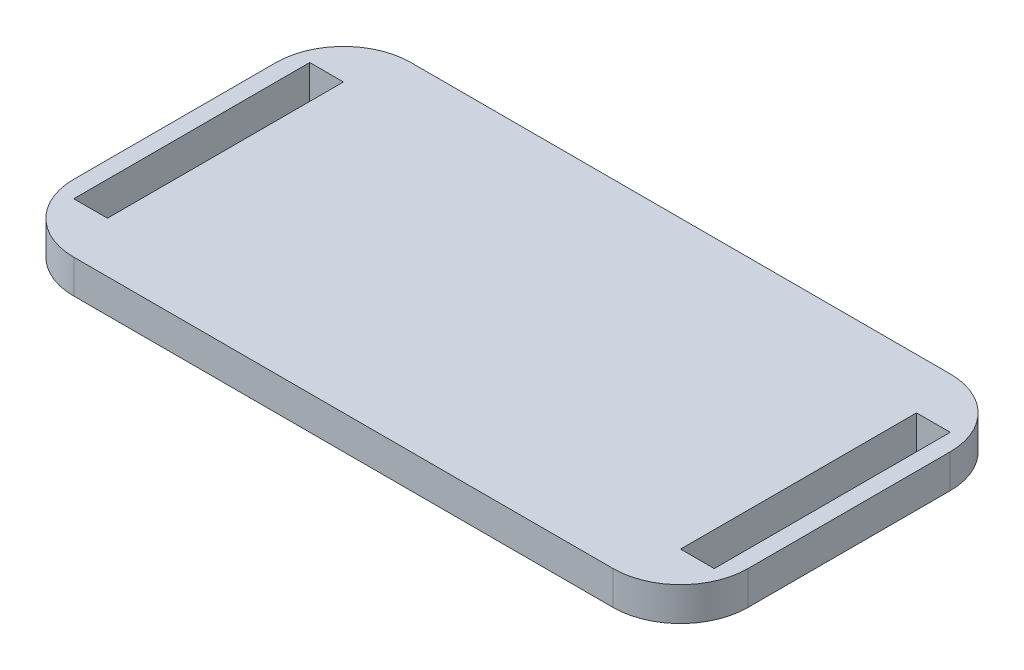
ISO-10303-21;
HEADER;
FILE_DESCRIPTION(('STEP AP214'),'2;1');
FILE_NAME('part.step','',(''),(''),'','','');
FILE_SCHEMA(('AUTOMOTIVE_DESIGN { 1 0 10303 214 1 1 1 1 }'));
ENDSEC;
DATA;
#1=APPLICATION_CONTEXT('core data for automotive mechanical design processes');
#2=APPLICATION_PROTOCOL_DEFINITION('international standard','automotive_design',2000,#1);
#3=PRODUCT_CONTEXT('',#1,'mechanical');
#4=PRODUCT('Part','Part','',(#3));
#5=PRODUCT_RELATED_PRODUCT_CATEGORY('part','',(#4));
#6=PRODUCT_DEFINITION_FORMATION('','',#4);
#7=PRODUCT_DEFINITION_CONTEXT('part definition',#1,'design');
#8=PRODUCT_DEFINITION('design','',#6,#7);
#9=PRODUCT_DEFINITION_SHAPE('','',#8);
#10=(LENGTH_UNIT() NAMED_UNIT(*) SI_UNIT(.MILLI.,.METRE.));
#11=(NAMED_UNIT(*) PLANE_ANGLE_UNIT() SI_UNIT($,.RADIAN.));
#12=(NAMED_UNIT(*) SI_UNIT($,.STERADIAN.) SOLID_ANGLE_UNIT());
#13=UNCERTAINTY_MEASURE_WITH_UNIT(LENGTH_MEASURE(1.E-05),#10,'distance_accuracy_value','');
#14=(GEOMETRIC_REPRESENTATION_CONTEXT(3) GLOBAL_UNCERTAINTY_ASSIGNED_CONTEXT((#13)) GLOBAL_UNIT_ASSIGNED_CONTEXT((#10,
#11,#12)) REPRESENTATION_CONTEXT('',''));
#15=CARTESIAN_POINT('',(0.,0.,0.));
#16=DIRECTION('',(0.,0.,1.));
#17=DIRECTION('',(1.,0.,0.));
#18=AXIS2_PLACEMENT_3D('',#15,#16,#17);
#19=CARTESIAN_POINT('',(40.,5.,-15.));
#20=DIRECTION('',(0.,-1.,0.));
#21=DIRECTION('',(0.,0.,-1.));
#22=AXIS2_PLACEMENT_3D('',#19,#20,#21);
#23=PLANE('',#22);
#24=DIRECTION('',(0.,0.,-1.));
#25=VECTOR('',#24,1.);
#26=CARTESIAN_POINT('',(-42.5,5.,17.5));
#27=LINE('',#26,#25);
#28=CARTESIAN_POINT('',(-42.5,5.,17.5));
#29=VERTEX_POINT('',#28);
#30=CARTESIAN_POINT('',(-42.5,5.,-17.5));
#31=VERTEX_POINT('',#30);
#32=EDGE_CURVE('E182',#29,#31,#27,.T.);
#33=ORIENTED_EDGE('',*,*,#32,.F.);
#34=DIRECTION('',(1.,0.,0.));
#35=VECTOR('',#34,1.);
#36=CARTESIAN_POINT('',(-47.5,5.,17.5));
#37=LINE('',#36,#35);
#38=CARTESIAN_POINT('',(-47.5,5.,17.5));
#39=VERTEX_POINT('',#38);
#40=EDGE_CURVE('E190',#39,#29,#37,.T.);
#41=ORIENTED_EDGE('',*,*,#40,.F.);
#42=DIRECTION('',(0.,0.,1.));
#43=VECTOR('',#42,1.);
#44=CARTESIAN_POINT('',(-47.5,5.,17.5));
#45=LINE('',#44,#43);
#46=CARTESIAN_POINT('',(-47.5,5.,-17.5));
#47=VERTEX_POINT('',#46);
#48=EDGE_CURVE('E187',#47,#39,#45,.T.);
#49=ORIENTED_EDGE('',*,*,#48,.F.);
#50=DIRECTION('',(-1.,0.,0.));
#51=VECTOR('',#50,1.);
#52=CARTESIAN_POINT('',(-47.5,5.,-17.5));
#53=LINE('',#52,#51);
#54=EDGE_CURVE('E184',#31,#47,#53,.T.);
#55=ORIENTED_EDGE('',*,*,#54,.F.);
#56=EDGE_LOOP('',(#33,#41,#49,#55));
#57=FACE_BOUND('',#56,.T.);
#58=CARTESIAN_POINT('',(40.,5.,-15.));
#59=DIRECTION('',(0.,1.,0.));
#60=DIRECTION('',(0.,0.,-1.));
#61=AXIS2_PLACEMENT_3D('',#58,#59,#60);
#62=CIRCLE('',#61,10.);
#63=CARTESIAN_POINT('',(50.,5.,-14.9999999999999));
#64=VERTEX_POINT('',#63);
#65=CARTESIAN_POINT('',(39.9999999999999,5.,-25.));
#66=VERTEX_POINT('',#65);
#67=EDGE_CURVE('E213',#64,#66,#62,.T.);
#68=ORIENTED_EDGE('',*,*,#67,.T.);
#69=DIRECTION('',(-1.,0.,0.));
#70=VECTOR('',#69,1.);
#71=CARTESIAN_POINT('',(-39.9999999999999,5.,-25.));
#72=LINE('',#71,#70);
#73=CARTESIAN_POINT('',(-39.9999999999999,5.,-25.));
#74=VERTEX_POINT('',#73);
#75=EDGE_CURVE('E216',#66,#74,#72,.T.);
#76=ORIENTED_EDGE('',*,*,#75,.T.);
#77=CARTESIAN_POINT('',(-40.,5.,-15.));
#78=DIRECTION('',(0.,1.,0.));
#79=DIRECTION('',(0.,0.,-1.));
#80=AXIS2_PLACEMENT_3D('',#77,#78,#79);
#81=CIRCLE('',#80,10.);
#82=CARTESIAN_POINT('',(-50.,5.,-14.9999999999999));
#83=VERTEX_POINT('',#82);
#84=EDGE_CURVE('E219',#74,#83,#81,.T.);
#85=ORIENTED_EDGE('',*,*,#84,.T.);
#86=DIRECTION('',(0.,0.,1.));
#87=VECTOR('',#86,1.);
#88=CARTESIAN_POINT('',(-50.,5.,14.9999999999999));
#89=LINE('',#88,#87);
#90=CARTESIAN_POINT('',(-50.,5.,14.9999999999999));
#91=VERTEX_POINT('',#90);
#92=EDGE_CURVE('E221',#83,#91,#89,.T.);
#93=ORIENTED_EDGE('',*,*,#92,.T.);
#94=CARTESIAN_POINT('',(-40.,5.,15.));
#95=DIRECTION('',(0.,1.,0.));
#96=DIRECTION('',(0.,0.,-1.));
#97=AXIS2_PLACEMENT_3D('',#94,#95,#96);
#98=CIRCLE('',#97,10.);
#99=CARTESIAN_POINT('',(-39.9999999999999,5.,25.));
#100=VERTEX_POINT('',#99);
#101=EDGE_CURVE('E223',#91,#100,#98,.T.);
#102=ORIENTED_EDGE('',*,*,#101,.T.);
#103=DIRECTION('',(1.,0.,0.));
#104=VECTOR('',#103,1.);
#105=CARTESIAN_POINT('',(-39.9999999999999,5.,25.));
#106=LINE('',#105,#104);
#107=CARTESIAN_POINT('',(39.9999999999999,5.,25.));
#108=VERTEX_POINT('',#107);
#109=EDGE_CURVE('E225',#100,#108,#106,.T.);
#110=ORIENTED_EDGE('',*,*,#109,.T.);
#111=CARTESIAN_POINT('',(40.,5.,15.));
#112=DIRECTION('',(0.,1.,0.));
#113=DIRECTION('',(0.,0.,1.));
#114=AXIS2_PLACEMENT_3D('',#111,#112,#113);
#115=CIRCLE('',#114,10.);
#116=CARTESIAN_POINT('',(50.,5.,14.9999999999999));
#117=VERTEX_POINT('',#116);
#118=EDGE_CURVE('E227',#108,#117,#115,.T.);
#119=ORIENTED_EDGE('',*,*,#118,.T.);
#120=DIRECTION('',(0.,0.,-1.));
#121=VECTOR('',#120,1.);
#122=CARTESIAN_POINT('',(50.,5.,14.9999999999999));
#123=LINE('',#122,#121);
#124=EDGE_CURVE('E229',#117,#64,#123,.T.);
#125=ORIENTED_EDGE('',*,*,#124,.T.);
#126=EDGE_LOOP('',(#68,#76,#85,#93,#102,#110,#119,#125));
#127=FACE_BOUND('',#126,.T.);
#128=DIRECTION('',(0.,0.,-1.));
#129=VECTOR('',#128,1.);
#130=CARTESIAN_POINT('',(47.5,5.,17.5));
#131=LINE('',#130,#129);
#132=CARTESIAN_POINT('',(47.5,5.,17.5));
#133=VERTEX_POINT('',#132);
#134=CARTESIAN_POINT('',(47.5,5.,-17.5));
#135=VERTEX_POINT('',#134);
#136=EDGE_CURVE('E146',#133,#135,#131,.T.);
#137=ORIENTED_EDGE('',*,*,#136,.F.);
#138=DIRECTION('',(1.,0.,0.));
#139=VECTOR('',#138,1.);
#140=CARTESIAN_POINT('',(42.5,5.,17.5));
#141=LINE('',#140,#139);
#142=CARTESIAN_POINT('',(42.5,5.,17.5));
#143=VERTEX_POINT('',#142);
#144=EDGE_CURVE('E168',#143,#133,#141,.T.);
#145=ORIENTED_EDGE('',*,*,#144,.F.);
#146=DIRECTION('',(0.,0.,1.));
#147=VECTOR('',#146,1.);
#148=CARTESIAN_POINT('',(42.5,5.,17.5));
#149=LINE('',#148,#147);
#150=CARTESIAN_POINT('',(42.5,5.,-17.5));
#151=VERTEX_POINT('',#150);
#152=EDGE_CURVE('E166',#151,#143,#149,.T.);
#153=ORIENTED_EDGE('',*,*,#152,.F.);
#154=DIRECTION('',(-1.,0.,0.));
#155=VECTOR('',#154,1.);
#156=CARTESIAN_POINT('',(42.5,5.,-17.5));
#157=LINE('',#156,#155);
#158=EDGE_CURVE('E154',#135,#151,#157,.T.);
#159=ORIENTED_EDGE('',*,*,#158,.F.);
#160=EDGE_LOOP('',(#137,#145,#153,#159));
#161=FACE_BOUND('',#160,.T.);
#162=ADVANCED_FACE('F33',(#57,#127,#161),#23,.F.);
#163=CARTESIAN_POINT('',(40.,0.,-15.));
#164=DIRECTION('',(0.,-1.,0.));
#165=DIRECTION('',(0.,0.,-1.));
#166=AXIS2_PLACEMENT_3D('',#163,#164,#165);
#167=PLANE('',#166);
#168=DIRECTION('',(1.,0.,0.));
#169=VECTOR('',#168,1.);
#170=CARTESIAN_POINT('',(-47.5,0.,17.5));
#171=LINE('',#170,#169);
#172=CARTESIAN_POINT('',(-47.5,0.,17.5));
#173=VERTEX_POINT('',#172);
#174=CARTESIAN_POINT('',(-42.5,0.,17.5));
#175=VERTEX_POINT('',#174);
#176=EDGE_CURVE('E185',#173,#175,#171,.T.);
#177=ORIENTED_EDGE('',*,*,#176,.T.);
#178=DIRECTION('',(0.,0.,-1.));
#179=VECTOR('',#178,1.);
#180=CARTESIAN_POINT('',(-42.5,0.,17.5));
#181=LINE('',#180,#179);
#182=CARTESIAN_POINT('',(-42.5,0.,-17.5));
#183=VERTEX_POINT('',#182);
#184=EDGE_CURVE('E162',#175,#183,#181,.T.);
#185=ORIENTED_EDGE('',*,*,#184,.T.);
#186=DIRECTION('',(-1.,0.,0.));
#187=VECTOR('',#186,1.);
#188=CARTESIAN_POINT('',(-47.5,0.,-17.5));
#189=LINE('',#188,#187);
#190=CARTESIAN_POINT('',(-47.5,0.,-17.5));
#191=VERTEX_POINT('',#190);
#192=EDGE_CURVE('E195',#183,#191,#189,.T.);
#193=ORIENTED_EDGE('',*,*,#192,.T.);
#194=DIRECTION('',(0.,0.,1.));
#195=VECTOR('',#194,1.);
#196=CARTESIAN_POINT('',(-47.5,0.,17.5));
#197=LINE('',#196,#195);
#198=EDGE_CURVE('E198',#191,#173,#197,.T.);
#199=ORIENTED_EDGE('',*,*,#198,.T.);
#200=EDGE_LOOP('',(#177,#185,#193,#199));
#201=FACE_BOUND('',#200,.T.);
#202=CARTESIAN_POINT('',(40.,0.,-15.));
#203=DIRECTION('',(0.,1.,0.));
#204=DIRECTION('',(0.,0.,-1.));
#205=AXIS2_PLACEMENT_3D('',#202,#203,#204);
#206=CIRCLE('',#205,10.);
#207=CARTESIAN_POINT('',(50.,0.,-14.9999999999999));
#208=VERTEX_POINT('',#207);
#209=CARTESIAN_POINT('',(39.9999999999999,0.,-25.));
#210=VERTEX_POINT('',#209);
#211=EDGE_CURVE('E212',#208,#210,#206,.T.);
#212=ORIENTED_EDGE('',*,*,#211,.F.);
#213=DIRECTION('',(0.,0.,-1.));
#214=VECTOR('',#213,1.);
#215=CARTESIAN_POINT('',(50.,0.,14.9999999999999));
#216=LINE('',#215,#214);
#217=CARTESIAN_POINT('',(50.,0.,14.9999999999999));
#218=VERTEX_POINT('',#217);
#219=EDGE_CURVE('E217',#218,#208,#216,.T.);
#220=ORIENTED_EDGE('',*,*,#219,.F.);
#221=CARTESIAN_POINT('',(40.,0.,15.));
#222=DIRECTION('',(0.,1.,0.));
#223=DIRECTION('',(0.,0.,1.));
#224=AXIS2_PLACEMENT_3D('',#221,#222,#223);
#225=CIRCLE('',#224,10.);
#226=CARTESIAN_POINT('',(39.9999999999999,0.,25.));
#227=VERTEX_POINT('',#226);
#228=EDGE_CURVE('E244',#227,#218,#225,.T.);
#229=ORIENTED_EDGE('',*,*,#228,.F.);
#230=DIRECTION('',(1.,0.,0.));
#231=VECTOR('',#230,1.);
#232=CARTESIAN_POINT('',(-39.9999999999999,0.,25.));
#233=LINE('',#232,#231);
#234=CARTESIAN_POINT('',(-39.9999999999999,0.,25.));
#235=VERTEX_POINT('',#234);
#236=EDGE_CURVE('E242',#235,#227,#233,.T.);
#237=ORIENTED_EDGE('',*,*,#236,.F.);
#238=CARTESIAN_POINT('',(-40.,0.,15.));
#239=DIRECTION('',(0.,1.,0.));
#240=DIRECTION('',(0.,0.,-1.));
#241=AXIS2_PLACEMENT_3D('',#238,#239,#240);
#242=CIRCLE('',#241,10.);
#243=CARTESIAN_POINT('',(-50.,0.,14.9999999999999));
#244=VERTEX_POINT('',#243);
#245=EDGE_CURVE('E240',#244,#235,#242,.T.);
#246=ORIENTED_EDGE('',*,*,#245,.F.);
#247=DIRECTION('',(0.,0.,1.));
#248=VECTOR('',#247,1.);
#249=CARTESIAN_POINT('',(-50.,0.,14.9999999999999));
#250=LINE('',#249,#248);
#251=CARTESIAN_POINT('',(-50.,0.,-14.9999999999999));
#252=VERTEX_POINT('',#251);
#253=EDGE_CURVE('E238',#252,#244,#250,.T.);
#254=ORIENTED_EDGE('',*,*,#253,.F.);
#255=CARTESIAN_POINT('',(-40.,0.,-15.));
#256=DIRECTION('',(0.,1.,0.));
#257=DIRECTION('',(0.,0.,-1.));
#258=AXIS2_PLACEMENT_3D('',#255,#256,#257);
#259=CIRCLE('',#258,10.);
#260=CARTESIAN_POINT('',(-39.9999999999999,0.,-25.));
#261=VERTEX_POINT('',#260);
#262=EDGE_CURVE('E236',#261,#252,#259,.T.);
#263=ORIENTED_EDGE('',*,*,#262,.F.);
#264=DIRECTION('',(-1.,0.,0.));
#265=VECTOR('',#264,1.);
#266=CARTESIAN_POINT('',(-39.9999999999999,0.,-25.));
#267=LINE('',#266,#265);
#268=EDGE_CURVE('E234',#210,#261,#267,.T.);
#269=ORIENTED_EDGE('',*,*,#268,.F.);
#270=EDGE_LOOP('',(#212,#220,#229,#237,#246,#254,#263,#269));
#271=FACE_BOUND('',#270,.T.);
#272=DIRECTION('',(1.,0.,0.));
#273=VECTOR('',#272,1.);
#274=CARTESIAN_POINT('',(42.5,0.,17.5));
#275=LINE('',#274,#273);
#276=CARTESIAN_POINT('',(42.5,0.,17.5));
#277=VERTEX_POINT('',#276);
#278=CARTESIAN_POINT('',(47.5,0.,17.5));
#279=VERTEX_POINT('',#278);
#280=EDGE_CURVE('E155',#277,#279,#275,.T.);
#281=ORIENTED_EDGE('',*,*,#280,.T.);
#282=DIRECTION('',(0.,0.,-1.));
#283=VECTOR('',#282,1.);
#284=CARTESIAN_POINT('',(47.5,0.,17.5));
#285=LINE('',#284,#283);
#286=CARTESIAN_POINT('',(47.5,0.,-17.5));
#287=VERTEX_POINT('',#286);
#288=EDGE_CURVE('E56',#279,#287,#285,.T.);
#289=ORIENTED_EDGE('',*,*,#288,.T.);
#290=DIRECTION('',(-1.,0.,0.));
#291=VECTOR('',#290,1.);
#292=CARTESIAN_POINT('',(42.5,0.,-17.5));
#293=LINE('',#292,#291);
#294=CARTESIAN_POINT('',(42.5,0.,-17.5));
#295=VERTEX_POINT('',#294);
#296=EDGE_CURVE('E161',#287,#295,#293,.T.);
#297=ORIENTED_EDGE('',*,*,#296,.T.);
#298=DIRECTION('',(0.,0.,1.));
#299=VECTOR('',#298,1.);
#300=CARTESIAN_POINT('',(42.5,0.,17.5));
#301=LINE('',#300,#299);
#302=EDGE_CURVE('E174',#295,#277,#301,.T.);
#303=ORIENTED_EDGE('',*,*,#302,.T.);
#304=EDGE_LOOP('',(#281,#289,#297,#303));
#305=FACE_BOUND('',#304,.T.);
#306=ADVANCED_FACE('F274',(#201,#271,#305),#167,.T.);
#307=CARTESIAN_POINT('',(40.,5.,-15.));
#308=DIRECTION('',(0.,-1.,0.));
#309=DIRECTION('',(0.,0.,-1.));
#310=AXIS2_PLACEMENT_3D('',#307,#308,#309);
#311=CYLINDRICAL_SURFACE('',#310,10.);
#312=ORIENTED_EDGE('',*,*,#211,.T.);
#313=DIRECTION('',(0.,-1.,0.));
#314=VECTOR('',#313,1.);
#315=CARTESIAN_POINT('',(39.9999999999999,5.,-25.));
#316=LINE('',#315,#314);
#317=EDGE_CURVE('E11',#66,#210,#316,.T.);
#318=ORIENTED_EDGE('',*,*,#317,.F.);
#319=ORIENTED_EDGE('',*,*,#67,.F.);
#320=DIRECTION('',(0.,-1.,0.));
#321=VECTOR('',#320,1.);
#322=CARTESIAN_POINT('',(50.,5.,-14.9999999999999));
#323=LINE('',#322,#321);
#324=EDGE_CURVE('E231',#64,#208,#323,.T.);
#325=ORIENTED_EDGE('',*,*,#324,.T.);
#326=EDGE_LOOP('',(#312,#318,#319,#325));
#327=FACE_BOUND('',#326,.T.);
#328=ADVANCED_FACE('F35',(#327),#311,.T.);
#329=CARTESIAN_POINT('',(-39.9999999999999,5.,-25.));
#330=DIRECTION('',(0.,0.,1.));
#331=DIRECTION('',(1.,0.,0.));
#332=AXIS2_PLACEMENT_3D('',#329,#330,#331);
#333=PLANE('',#332);
#334=ORIENTED_EDGE('',*,*,#268,.T.);
#335=DIRECTION('',(0.,-1.,0.));
#336=VECTOR('',#335,1.);
#337=CARTESIAN_POINT('',(-39.9999999999999,5.,-25.));
#338=LINE('',#337,#336);
#339=EDGE_CURVE('E41',#74,#261,#338,.T.);
#340=ORIENTED_EDGE('',*,*,#339,.F.);
#341=ORIENTED_EDGE('',*,*,#75,.F.);
#342=ORIENTED_EDGE('',*,*,#317,.T.);
#343=EDGE_LOOP('',(#334,#340,#341,#342));
#344=FACE_BOUND('',#343,.T.);
#345=ADVANCED_FACE('F291',(#344),#333,.F.);
#346=CARTESIAN_POINT('',(-40.,5.,-15.));
#347=DIRECTION('',(0.,-1.,0.));
#348=DIRECTION('',(0.,0.,-1.));
#349=AXIS2_PLACEMENT_3D('',#346,#347,#348);
#350=CYLINDRICAL_SURFACE('',#349,10.);
#351=ORIENTED_EDGE('',*,*,#262,.T.);
#352=DIRECTION('',(0.,-1.,0.));
#353=VECTOR('',#352,1.);
#354=CARTESIAN_POINT('',(-50.,5.,-14.9999999999999));
#355=LINE('',#354,#353);
#356=EDGE_CURVE('E261',#83,#252,#355,.T.);
#357=ORIENTED_EDGE('',*,*,#356,.F.);
#358=ORIENTED_EDGE('',*,*,#84,.F.);
#359=ORIENTED_EDGE('',*,*,#339,.T.);
#360=EDGE_LOOP('',(#351,#357,#358,#359));
#361=FACE_BOUND('',#360,.T.);
#362=ADVANCED_FACE('F268',(#361),#350,.T.);
#363=CARTESIAN_POINT('',(-50.,5.,14.9999999999999));
#364=DIRECTION('',(1.,0.,0.));
#365=DIRECTION('',(0.,0.,-1.));
#366=AXIS2_PLACEMENT_3D('',#363,#364,#365);
#367=PLANE('',#366);
#368=ORIENTED_EDGE('',*,*,#253,.T.);
#369=DIRECTION('',(0.,-1.,0.));
#370=VECTOR('',#369,1.);
#371=CARTESIAN_POINT('',(-50.,5.,14.9999999999999));
#372=LINE('',#371,#370);
#373=EDGE_CURVE('E258',#91,#244,#372,.T.);
#374=ORIENTED_EDGE('',*,*,#373,.F.);
#375=ORIENTED_EDGE('',*,*,#92,.F.);
#376=ORIENTED_EDGE('',*,*,#356,.T.);
#377=EDGE_LOOP('',(#368,#374,#375,#376));
#378=FACE_BOUND('',#377,.T.);
#379=ADVANCED_FACE('F280',(#378),#367,.F.);
#380=CARTESIAN_POINT('',(-40.,5.,15.));
#381=DIRECTION('',(0.,-1.,0.));
#382=DIRECTION('',(0.,0.,-1.));
#383=AXIS2_PLACEMENT_3D('',#380,#381,#382);
#384=CYLINDRICAL_SURFACE('',#383,10.);
#385=ORIENTED_EDGE('',*,*,#245,.T.);
#386=DIRECTION('',(0.,-1.,0.));
#387=VECTOR('',#386,1.);
#388=CARTESIAN_POINT('',(-39.9999999999999,5.,25.));
#389=LINE('',#388,#387);
#390=EDGE_CURVE('E255',#100,#235,#389,.T.);
#391=ORIENTED_EDGE('',*,*,#390,.F.);
#392=ORIENTED_EDGE('',*,*,#101,.F.);
#393=ORIENTED_EDGE('',*,*,#373,.T.);
#394=EDGE_LOOP('',(#385,#391,#392,#393));
#395=FACE_BOUND('',#394,.T.);
#396=ADVANCED_FACE('F284',(#395),#384,.T.);
#397=CARTESIAN_POINT('',(-39.9999999999999,5.,25.));
#398=DIRECTION('',(0.,0.,-1.));
#399=DIRECTION('',(-1.,0.,0.));
#400=AXIS2_PLACEMENT_3D('',#397,#398,#399);
#401=PLANE('',#400);
#402=ORIENTED_EDGE('',*,*,#236,.T.);
#403=DIRECTION('',(0.,-1.,0.));
#404=VECTOR('',#403,1.);
#405=CARTESIAN_POINT('',(39.9999999999999,5.,25.));
#406=LINE('',#405,#404);
#407=EDGE_CURVE('E252',#108,#227,#406,.T.);
#408=ORIENTED_EDGE('',*,*,#407,.F.);
#409=ORIENTED_EDGE('',*,*,#109,.F.);
#410=ORIENTED_EDGE('',*,*,#390,.T.);
#411=EDGE_LOOP('',(#402,#408,#409,#410));
#412=FACE_BOUND('',#411,.T.);
#413=ADVANCED_FACE('F304',(#412),#401,.F.);
#414=CARTESIAN_POINT('',(40.,5.,15.));
#415=DIRECTION('',(0.,-1.,0.));
#416=DIRECTION('',(0.,0.,-1.));
#417=AXIS2_PLACEMENT_3D('',#414,#415,#416);
#418=CYLINDRICAL_SURFACE('',#417,10.);
#419=ORIENTED_EDGE('',*,*,#228,.T.);
#420=DIRECTION('',(0.,-1.,0.));
#421=VECTOR('',#420,1.);
#422=CARTESIAN_POINT('',(50.,5.,14.9999999999999));
#423=LINE('',#422,#421);
#424=EDGE_CURVE('E249',#117,#218,#423,.T.);
#425=ORIENTED_EDGE('',*,*,#424,.F.);
#426=ORIENTED_EDGE('',*,*,#118,.F.);
#427=ORIENTED_EDGE('',*,*,#407,.T.);
#428=EDGE_LOOP('',(#419,#425,#426,#427));
#429=FACE_BOUND('',#428,.T.);
#430=ADVANCED_FACE('F302',(#429),#418,.T.);
#431=CARTESIAN_POINT('',(50.,5.,14.9999999999999));
#432=DIRECTION('',(-1.,0.,0.));
#433=DIRECTION('',(0.,0.,1.));
#434=AXIS2_PLACEMENT_3D('',#431,#432,#433);
#435=PLANE('',#434);
#436=ORIENTED_EDGE('',*,*,#219,.T.);
#437=ORIENTED_EDGE('',*,*,#324,.F.);
#438=ORIENTED_EDGE('',*,*,#124,.F.);
#439=ORIENTED_EDGE('',*,*,#424,.T.);
#440=EDGE_LOOP('',(#436,#437,#438,#439));
#441=FACE_BOUND('',#440,.T.);
#442=ADVANCED_FACE('F297',(#441),#435,.F.);
#443=CARTESIAN_POINT('',(-42.5,5.,17.5));
#444=DIRECTION('',(-1.,0.,0.));
#445=DIRECTION('',(0.,0.,1.));
#446=AXIS2_PLACEMENT_3D('',#443,#444,#445);
#447=PLANE('',#446);
#448=ORIENTED_EDGE('',*,*,#184,.F.);
#449=DIRECTION('',(0.,-1.,0.));
#450=VECTOR('',#449,1.);
#451=CARTESIAN_POINT('',(-42.5,5.,17.5));
#452=LINE('',#451,#450);
#453=EDGE_CURVE('E192',#29,#175,#452,.T.);
#454=ORIENTED_EDGE('',*,*,#453,.F.);
#455=ORIENTED_EDGE('',*,*,#32,.T.);
#456=DIRECTION('',(0.,-1.,0.));
#457=VECTOR('',#456,1.);
#458=CARTESIAN_POINT('',(-42.5,5.,-17.5));
#459=LINE('',#458,#457);
#460=EDGE_CURVE('E209',#31,#183,#459,.T.);
#461=ORIENTED_EDGE('',*,*,#460,.T.);
#462=EDGE_LOOP('',(#448,#454,#455,#461));
#463=FACE_BOUND('',#462,.T.);
#464=ADVANCED_FACE('F323',(#463),#447,.T.);
#465=CARTESIAN_POINT('',(-47.5,5.,-17.5));
#466=DIRECTION('',(0.,0.,1.));
#467=DIRECTION('',(1.,0.,0.));
#468=AXIS2_PLACEMENT_3D('',#465,#466,#467);
#469=PLANE('',#468);
#470=ORIENTED_EDGE('',*,*,#192,.F.);
#471=ORIENTED_EDGE('',*,*,#460,.F.);
#472=ORIENTED_EDGE('',*,*,#54,.T.);
#473=DIRECTION('',(0.,-1.,0.));
#474=VECTOR('',#473,1.);
#475=CARTESIAN_POINT('',(-47.5,5.,-17.5));
#476=LINE('',#475,#474);
#477=EDGE_CURVE('E207',#47,#191,#476,.T.);
#478=ORIENTED_EDGE('',*,*,#477,.T.);
#479=EDGE_LOOP('',(#470,#471,#472,#478));
#480=FACE_BOUND('',#479,.T.);
#481=ADVANCED_FACE('F330',(#480),#469,.T.);
#482=CARTESIAN_POINT('',(-47.5,5.,17.5));
#483=DIRECTION('',(1.,0.,0.));
#484=DIRECTION('',(0.,0.,-1.));
#485=AXIS2_PLACEMENT_3D('',#482,#483,#484);
#486=PLANE('',#485);
#487=ORIENTED_EDGE('',*,*,#198,.F.);
#488=ORIENTED_EDGE('',*,*,#477,.F.);
#489=ORIENTED_EDGE('',*,*,#48,.T.);
#490=DIRECTION('',(0.,-1.,0.));
#491=VECTOR('',#490,1.);
#492=CARTESIAN_POINT('',(-47.5,5.,17.5));
#493=LINE('',#492,#491);
#494=EDGE_CURVE('E205',#39,#173,#493,.T.);
#495=ORIENTED_EDGE('',*,*,#494,.T.);
#496=EDGE_LOOP('',(#487,#488,#489,#495));
#497=FACE_BOUND('',#496,.T.);
#498=ADVANCED_FACE('F335',(#497),#486,.T.);
#499=CARTESIAN_POINT('',(-47.5,5.,17.5));
#500=DIRECTION('',(0.,0.,-1.));
#501=DIRECTION('',(-1.,0.,0.));
#502=AXIS2_PLACEMENT_3D('',#499,#500,#501);
#503=PLANE('',#502);
#504=ORIENTED_EDGE('',*,*,#176,.F.);
#505=ORIENTED_EDGE('',*,*,#494,.F.);
#506=ORIENTED_EDGE('',*,*,#40,.T.);
#507=ORIENTED_EDGE('',*,*,#453,.T.);
#508=EDGE_LOOP('',(#504,#505,#506,#507));
#509=FACE_BOUND('',#508,.T.);
#510=ADVANCED_FACE('F341',(#509),#503,.T.);
#511=CARTESIAN_POINT('',(47.5,5.,17.5));
#512=DIRECTION('',(-1.,0.,0.));
#513=DIRECTION('',(0.,0.,1.));
#514=AXIS2_PLACEMENT_3D('',#511,#512,#513);
#515=PLANE('',#514);
#516=ORIENTED_EDGE('',*,*,#288,.F.);
#517=DIRECTION('',(0.,-1.,0.));
#518=VECTOR('',#517,1.);
#519=CARTESIAN_POINT('',(47.5,5.,17.5));
#520=LINE('',#519,#518);
#521=EDGE_CURVE('E150',#133,#279,#520,.T.);
#522=ORIENTED_EDGE('',*,*,#521,.F.);
#523=ORIENTED_EDGE('',*,*,#136,.T.);
#524=DIRECTION('',(0.,-1.,0.));
#525=VECTOR('',#524,1.);
#526=CARTESIAN_POINT('',(47.5,5.,-17.5));
#527=LINE('',#526,#525);
#528=EDGE_CURVE('E149',#135,#287,#527,.T.);
#529=ORIENTED_EDGE('',*,*,#528,.T.);
#530=EDGE_LOOP('',(#516,#522,#523,#529));
#531=FACE_BOUND('',#530,.T.);
#532=ADVANCED_FACE('F148',(#531),#515,.T.);
#533=CARTESIAN_POINT('',(42.5,5.,-17.5));
#534=DIRECTION('',(0.,0.,1.));
#535=DIRECTION('',(1.,0.,0.));
#536=AXIS2_PLACEMENT_3D('',#533,#534,#535);
#537=PLANE('',#536);
#538=ORIENTED_EDGE('',*,*,#296,.F.);
#539=ORIENTED_EDGE('',*,*,#528,.F.);
#540=ORIENTED_EDGE('',*,*,#158,.T.);
#541=DIRECTION('',(0.,-1.,0.));
#542=VECTOR('',#541,1.);
#543=CARTESIAN_POINT('',(42.5,5.,-17.5));
#544=LINE('',#543,#542);
#545=EDGE_CURVE('E163',#151,#295,#544,.T.);
#546=ORIENTED_EDGE('',*,*,#545,.T.);
#547=EDGE_LOOP('',(#538,#539,#540,#546));
#548=FACE_BOUND('',#547,.T.);
#549=ADVANCED_FACE('F158',(#548),#537,.T.);
#550=CARTESIAN_POINT('',(42.5,5.,17.5));
#551=DIRECTION('',(1.,0.,0.));
#552=DIRECTION('',(0.,0.,-1.));
#553=AXIS2_PLACEMENT_3D('',#550,#551,#552);
#554=PLANE('',#553);
#555=ORIENTED_EDGE('',*,*,#302,.F.);
#556=ORIENTED_EDGE('',*,*,#545,.F.);
#557=ORIENTED_EDGE('',*,*,#152,.T.);
#558=DIRECTION('',(0.,-1.,0.));
#559=VECTOR('',#558,1.);
#560=CARTESIAN_POINT('',(42.5,5.,17.5));
#561=LINE('',#560,#559);
#562=EDGE_CURVE('E48',#143,#277,#561,.T.);
#563=ORIENTED_EDGE('',*,*,#562,.T.);
#564=EDGE_LOOP('',(#555,#556,#557,#563));
#565=FACE_BOUND('',#564,.T.);
#566=ADVANCED_FACE('F359',(#565),#554,.T.);
#567=CARTESIAN_POINT('',(42.5,5.,17.5));
#568=DIRECTION('',(0.,0.,-1.));
#569=DIRECTION('',(-1.,0.,0.));
#570=AXIS2_PLACEMENT_3D('',#567,#568,#569);
#571=PLANE('',#570);
#572=ORIENTED_EDGE('',*,*,#280,.F.);
#573=ORIENTED_EDGE('',*,*,#562,.F.);
#574=ORIENTED_EDGE('',*,*,#144,.T.);
#575=ORIENTED_EDGE('',*,*,#521,.T.);
#576=EDGE_LOOP('',(#572,#573,#574,#575));
#577=FACE_BOUND('',#576,.T.);
#578=ADVANCED_FACE('F362',(#577),#571,.T.);
#579=CLOSED_SHELL('',(#162,#306,#328,#345,#362,#379,#396,#413,#430,#442,#464,#481,#498,#510,
#532,#549,#566,#578));
#580=MANIFOLD_SOLID_BREP('B2',#579);
#581=ADVANCED_BREP_SHAPE_REPRESENTATION('',(#18,#580),#14);
#582=SHAPE_DEFINITION_REPRESENTATION(#9,#581);
ENDSEC;
END-ISO-10303-21;
